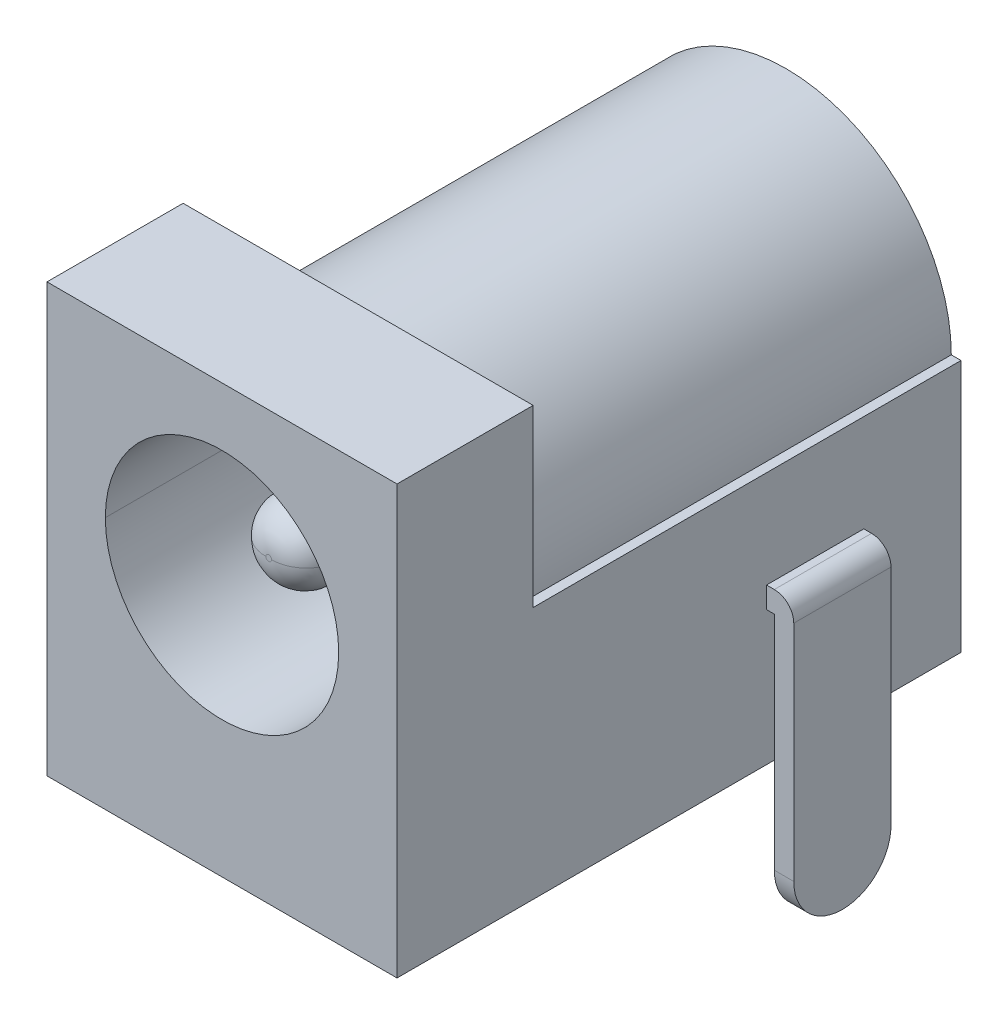
ISO-10303-21;
HEADER;
FILE_DESCRIPTION(('STEP AP214'),'2;1');
FILE_NAME('part.step','',(''),(''),'','','');
FILE_SCHEMA(('AUTOMOTIVE_DESIGN { 1 0 10303 214 1 1 1 1 }'));
ENDSEC;
DATA;
#1=APPLICATION_CONTEXT('core data for automotive mechanical design processes');
#2=APPLICATION_PROTOCOL_DEFINITION('international standard','automotive_design',2000,#1);
#3=PRODUCT_CONTEXT('',#1,'mechanical');
#4=PRODUCT('Part','Part','',(#3));
#5=PRODUCT_RELATED_PRODUCT_CATEGORY('part','',(#4));
#6=PRODUCT_DEFINITION_FORMATION('','',#4);
#7=PRODUCT_DEFINITION_CONTEXT('part definition',#1,'design');
#8=PRODUCT_DEFINITION('design','',#6,#7);
#9=PRODUCT_DEFINITION_SHAPE('','',#8);
#10=(LENGTH_UNIT() NAMED_UNIT(*) SI_UNIT(.MILLI.,.METRE.));
#11=(NAMED_UNIT(*) PLANE_ANGLE_UNIT() SI_UNIT($,.RADIAN.));
#12=(NAMED_UNIT(*) SI_UNIT($,.STERADIAN.) SOLID_ANGLE_UNIT());
#13=UNCERTAINTY_MEASURE_WITH_UNIT(LENGTH_MEASURE(1.E-05),#10,'distance_accuracy_value','');
#14=(GEOMETRIC_REPRESENTATION_CONTEXT(3) GLOBAL_UNCERTAINTY_ASSIGNED_CONTEXT((#13)) GLOBAL_UNIT_ASSIGNED_CONTEXT((#10,
#11,#12)) REPRESENTATION_CONTEXT('',''));
#15=CARTESIAN_POINT('',(0.,0.,0.));
#16=DIRECTION('',(0.,0.,1.));
#17=DIRECTION('',(1.,0.,0.));
#18=AXIS2_PLACEMENT_3D('',#15,#16,#17);
#19=CARTESIAN_POINT('',(4.5,6.5,-1.2));
#20=DIRECTION('',(0.,0.,1.));
#21=DIRECTION('',(1.,0.,0.));
#22=AXIS2_PLACEMENT_3D('',#19,#20,#21);
#23=PLANE('',#22);
#24=CARTESIAN_POINT('',(4.425,6.5,-1.2));
#25=CARTESIAN_POINT('',(4.425,6.65,-1.2));
#26=CARTESIAN_POINT('',(4.575,6.65,-1.2));
#27=CARTESIAN_POINT('',(4.575,6.5,-1.2));
#28=(BOUNDED_CURVE() B_SPLINE_CURVE(3,(#24,#25,#26,#27),.UNSPECIFIED.,.F.,
.F.) B_SPLINE_CURVE_WITH_KNOTS((4,4),(0.,1.),
.UNSPECIFIED.) CURVE() GEOMETRIC_REPRESENTATION_ITEM() RATIONAL_B_SPLINE_CURVE((1.,
0.333333333333,0.333333333333,1.)) REPRESENTATION_ITEM(''));
#29=CARTESIAN_POINT('',(4.425,6.5,-1.2));
#30=VERTEX_POINT('',#29);
#31=CARTESIAN_POINT('',(4.575,6.5,-1.2));
#32=VERTEX_POINT('',#31);
#33=EDGE_CURVE('E11',#30,#32,#28,.T.);
#34=ORIENTED_EDGE('',*,*,#33,.F.);
#35=CARTESIAN_POINT('',(4.575,6.5,-1.2));
#36=CARTESIAN_POINT('',(4.575,6.35,-1.2));
#37=CARTESIAN_POINT('',(4.425,6.35,-1.2));
#38=CARTESIAN_POINT('',(4.425,6.5,-1.2));
#39=(BOUNDED_CURVE() B_SPLINE_CURVE(3,(#35,#36,#37,#38),.UNSPECIFIED.,.F.,
.F.) B_SPLINE_CURVE_WITH_KNOTS((4,4),(0.,1.),
.UNSPECIFIED.) CURVE() GEOMETRIC_REPRESENTATION_ITEM() RATIONAL_B_SPLINE_CURVE((1.,
0.333333333333,0.333333333333,1.)) REPRESENTATION_ITEM(''));
#40=EDGE_CURVE('E541',#32,#30,#39,.T.);
#41=ORIENTED_EDGE('',*,*,#40,.F.);
#42=EDGE_LOOP('',(#34,#41));
#43=FACE_BOUND('',#42,.T.);
#44=ADVANCED_FACE('F17',(#43),#23,.T.);
#45=CARTESIAN_POINT('',(4.575,6.5,-1.2));
#46=CARTESIAN_POINT('',(4.575,6.65,-1.2));
#47=CARTESIAN_POINT('',(4.425,6.65,-1.2));
#48=CARTESIAN_POINT('',(4.425,6.5,-1.2));
#49=CARTESIAN_POINT('',(5.102207793864,6.5,-1.2));
#50=CARTESIAN_POINT('',(5.10220779386401,7.70441558772799,-1.2));
#51=CARTESIAN_POINT('',(3.897792206136,7.70441558772799,-1.2));
#52=CARTESIAN_POINT('',(3.897792206136,6.5,-1.2));
#53=CARTESIAN_POINT('',(5.475,6.5,-1.572792206136));
#54=CARTESIAN_POINT('',(5.475,8.45,-1.572792206136));
#55=CARTESIAN_POINT('',(3.525,8.45,-1.572792206136));
#56=CARTESIAN_POINT('',(3.525,6.5,-1.572792206136));
#57=CARTESIAN_POINT('',(5.475,6.5,-2.1));
#58=CARTESIAN_POINT('',(5.475,8.45,-2.1));
#59=CARTESIAN_POINT('',(3.525,8.45,-2.1));
#60=CARTESIAN_POINT('',(3.525,6.5,-2.1));
#61=(BOUNDED_SURFACE() B_SPLINE_SURFACE(3,3,((#45,#46,#47,#48),(#49,#50,#51,#52),(#53,#54,#55,
#56),(#57,#58,#59,#60)),.UNSPECIFIED.,.F.,.F.,.F.) B_SPLINE_SURFACE_WITH_KNOTS((4,4),(4,4),(0.,
1.),(0.,1.),.UNSPECIFIED.) GEOMETRIC_REPRESENTATION_ITEM() RATIONAL_B_SPLINE_SURFACE(((1.,
0.333333333333,0.333333333333,1.),(0.804737854124,0.268245951375,0.268245951375,0.804737854124),
(0.804737854124,0.268245951375,0.268245951375,0.804737854124),(1.,0.333333333333,0.333333333333,1.))) REPRESENTATION_ITEM('') SURFACE());
#62=CARTESIAN_POINT('',(4.425,6.5,-2.1));
#63=DIRECTION('',(0.,-1.,0.));
#64=DIRECTION('',(-1.,0.,0.));
#65=AXIS2_PLACEMENT_3D('',#62,#63,#64);
#66=CIRCLE('',#65,0.9);
#67=CARTESIAN_POINT('',(3.525,6.5,-2.1));
#68=VERTEX_POINT('',#67);
#69=EDGE_CURVE('E442',#30,#68,#66,.T.);
#70=CARTESIAN_POINT('',(4.575,6.5,-2.1));
#71=DIRECTION('',(0.,1.,0.));
#72=DIRECTION('',(1.,0.,0.));
#73=AXIS2_PLACEMENT_3D('',#70,#71,#72);
#74=CIRCLE('',#73,0.9);
#75=CARTESIAN_POINT('',(5.475,6.5,-2.1));
#76=VERTEX_POINT('',#75);
#77=EDGE_CURVE('E361',#32,#76,#74,.T.);
#78=CARTESIAN_POINT('',(4.5,6.5,-2.1));
#79=DIRECTION('',(0.,0.,-1.));
#80=DIRECTION('',(-1.,0.,0.));
#81=AXIS2_PLACEMENT_3D('',#78,#79,#80);
#82=CIRCLE('',#81,0.975);
#83=EDGE_CURVE('E298',#68,#76,#82,.T.);
#84=ORIENTED_EDGE('',*,*,#69,.F.);
#85=ORIENTED_EDGE('',*,*,#33,.T.);
#86=ORIENTED_EDGE('',*,*,#77,.T.);
#87=ORIENTED_EDGE('',*,*,#83,.F.);
#88=EDGE_LOOP('',(#84,#85,#86,#87));
#89=FACE_BOUND('',#88,.T.);
#90=ADVANCED_FACE('F616',(#89),#61,.T.);
#91=CARTESIAN_POINT('',(4.5,6.5,-1.2));
#92=DIRECTION('',(0.,0.,-1.));
#93=DIRECTION('',(-1.,0.,0.));
#94=AXIS2_PLACEMENT_3D('',#91,#92,#93);
#95=CYLINDRICAL_SURFACE('',#94,0.975);
#96=DIRECTION('',(0.,0.,-1.));
#97=VECTOR('',#96,1.);
#98=CARTESIAN_POINT('',(5.475,6.5,-1.2));
#99=LINE('',#98,#97);
#100=CARTESIAN_POINT('',(5.475,6.5,-9.2));
#101=VERTEX_POINT('',#100);
#102=EDGE_CURVE('E302',#76,#101,#99,.T.);
#103=ORIENTED_EDGE('',*,*,#102,.F.);
#104=CARTESIAN_POINT('',(4.5,6.5,-2.1));
#105=DIRECTION('',(0.,0.,-1.));
#106=DIRECTION('',(-1.,0.,0.));
#107=AXIS2_PLACEMENT_3D('',#104,#105,#106);
#108=CIRCLE('',#107,0.975);
#109=EDGE_CURVE('E438',#76,#68,#108,.T.);
#110=ORIENTED_EDGE('',*,*,#109,.T.);
#111=DIRECTION('',(0.,0.,-1.));
#112=VECTOR('',#111,1.);
#113=CARTESIAN_POINT('',(3.525,6.5,-1.2));
#114=LINE('',#113,#112);
#115=CARTESIAN_POINT('',(3.525,6.5,-9.2));
#116=VERTEX_POINT('',#115);
#117=EDGE_CURVE('E443',#68,#116,#114,.T.);
#118=ORIENTED_EDGE('',*,*,#117,.T.);
#119=CARTESIAN_POINT('',(4.5,6.5,-9.2));
#120=DIRECTION('',(0.,0.,-1.));
#121=DIRECTION('',(-1.,0.,0.));
#122=AXIS2_PLACEMENT_3D('',#119,#120,#121);
#123=CIRCLE('',#122,0.975);
#124=EDGE_CURVE('E458',#101,#116,#123,.T.);
#125=ORIENTED_EDGE('',*,*,#124,.F.);
#126=EDGE_LOOP('',(#103,#110,#118,#125));
#127=FACE_BOUND('',#126,.T.);
#128=ADVANCED_FACE('F622',(#127),#95,.T.);
#129=CARTESIAN_POINT('',(9.7,-2.25,-10.75));
#130=DIRECTION('',(-1.,0.,0.));
#131=DIRECTION('',(0.,0.,1.));
#132=AXIS2_PLACEMENT_3D('',#129,#130,#131);
#133=CYLINDRICAL_SURFACE('',#132,1.25);
#134=CARTESIAN_POINT('',(9.7,-2.25,-10.75));
#135=DIRECTION('',(1.,0.,0.));
#136=DIRECTION('',(0.,0.,1.));
#137=AXIS2_PLACEMENT_3D('',#134,#135,#136);
#138=CIRCLE('',#137,1.25);
#139=CARTESIAN_POINT('',(9.7,-2.25,-9.5));
#140=VERTEX_POINT('',#139);
#141=CARTESIAN_POINT('',(9.7,-2.25,-12.));
#142=VERTEX_POINT('',#141);
#143=EDGE_CURVE('E403',#140,#142,#138,.T.);
#144=ORIENTED_EDGE('',*,*,#143,.F.);
#145=DIRECTION('',(-1.,0.,0.));
#146=VECTOR('',#145,1.);
#147=CARTESIAN_POINT('',(11.759304320515,-2.25,-9.5));
#148=LINE('',#147,#146);
#149=CARTESIAN_POINT('',(9.2,-2.25,-9.5));
#150=VERTEX_POINT('',#149);
#151=EDGE_CURVE('E485',#140,#150,#148,.T.);
#152=ORIENTED_EDGE('',*,*,#151,.T.);
#153=CARTESIAN_POINT('',(9.2,-2.25,-10.75));
#154=DIRECTION('',(1.,0.,0.));
#155=DIRECTION('',(0.,0.,1.));
#156=AXIS2_PLACEMENT_3D('',#153,#154,#155);
#157=CIRCLE('',#156,1.25);
#158=CARTESIAN_POINT('',(9.2,-2.25,-12.));
#159=VERTEX_POINT('',#158);
#160=EDGE_CURVE('E416',#150,#159,#157,.T.);
#161=ORIENTED_EDGE('',*,*,#160,.T.);
#162=DIRECTION('',(1.,0.,0.));
#163=VECTOR('',#162,1.);
#164=CARTESIAN_POINT('',(11.759304320515,-2.25,-12.));
#165=LINE('',#164,#163);
#166=EDGE_CURVE('E29',#159,#142,#165,.T.);
#167=ORIENTED_EDGE('',*,*,#166,.T.);
#168=EDGE_LOOP('',(#144,#152,#161,#167));
#169=FACE_BOUND('',#168,.T.);
#170=ADVANCED_FACE('F645',(#169),#133,.T.);
#171=CARTESIAN_POINT('',(11.759304320515,4.,-12.));
#172=DIRECTION('',(0.,0.,1.));
#173=DIRECTION('',(1.,0.,0.));
#174=AXIS2_PLACEMENT_3D('',#171,#172,#173);
#175=PLANE('',#174);
#176=CARTESIAN_POINT('',(9.2,3.5,-12.));
#177=DIRECTION('',(0.,0.,1.));
#178=DIRECTION('',(-1.,0.,0.));
#179=AXIS2_PLACEMENT_3D('',#176,#177,#178);
#180=CIRCLE('',#179,0.5);
#181=CARTESIAN_POINT('',(9.7,3.5,-12.));
#182=VERTEX_POINT('',#181);
#183=CARTESIAN_POINT('',(9.2,4.,-12.));
#184=VERTEX_POINT('',#183);
#185=EDGE_CURVE('E333',#182,#184,#180,.T.);
#186=ORIENTED_EDGE('',*,*,#185,.F.);
#187=DIRECTION('',(0.,1.,0.));
#188=VECTOR('',#187,1.);
#189=CARTESIAN_POINT('',(9.7,-2.25,-12.));
#190=LINE('',#189,#188);
#191=EDGE_CURVE('E407',#142,#182,#190,.T.);
#192=ORIENTED_EDGE('',*,*,#191,.F.);
#193=ORIENTED_EDGE('',*,*,#166,.F.);
#194=DIRECTION('',(0.,1.,0.));
#195=VECTOR('',#194,1.);
#196=CARTESIAN_POINT('',(9.2,-2.25,-12.));
#197=LINE('',#196,#195);
#198=CARTESIAN_POINT('',(9.2,3.452242202242,-12.));
#199=VERTEX_POINT('',#198);
#200=EDGE_CURVE('E335',#159,#199,#197,.T.);
#201=ORIENTED_EDGE('',*,*,#200,.T.);
#202=DIRECTION('',(1.,0.,0.));
#203=VECTOR('',#202,1.);
#204=CARTESIAN_POINT('',(11.759304320515,3.452242202242,-12.));
#205=LINE('',#204,#203);
#206=CARTESIAN_POINT('',(9.,3.452242202242,-12.));
#207=VERTEX_POINT('',#206);
#208=EDGE_CURVE('E453',#207,#199,#205,.T.);
#209=ORIENTED_EDGE('',*,*,#208,.F.);
#210=DIRECTION('',(0.,-1.,0.));
#211=VECTOR('',#210,1.);
#212=CARTESIAN_POINT('',(9.,4.,-12.));
#213=LINE('',#212,#211);
#214=CARTESIAN_POINT('',(9.,4.,-12.));
#215=VERTEX_POINT('',#214);
#216=EDGE_CURVE('E366',#215,#207,#213,.T.);
#217=ORIENTED_EDGE('',*,*,#216,.F.);
#218=DIRECTION('',(-1.,0.,0.));
#219=VECTOR('',#218,1.);
#220=CARTESIAN_POINT('',(11.759304320515,4.,-12.));
#221=LINE('',#220,#219);
#222=EDGE_CURVE('E399',#184,#215,#221,.T.);
#223=ORIENTED_EDGE('',*,*,#222,.F.);
#224=EDGE_LOOP('',(#186,#192,#193,#201,#209,#217,#223));
#225=FACE_BOUND('',#224,.T.);
#226=ADVANCED_FACE('F641',(#225),#175,.F.);
#227=CARTESIAN_POINT('',(11.759304320515,4.,-9.5));
#228=DIRECTION('',(0.,0.,-1.));
#229=DIRECTION('',(0.,-1.,0.));
#230=AXIS2_PLACEMENT_3D('',#227,#228,#229);
#231=PLANE('',#230);
#232=CARTESIAN_POINT('',(9.2,3.5,-9.5));
#233=DIRECTION('',(0.,0.,-1.));
#234=DIRECTION('',(-1.,0.,0.));
#235=AXIS2_PLACEMENT_3D('',#232,#233,#234);
#236=CIRCLE('',#235,0.5);
#237=CARTESIAN_POINT('',(9.2,4.,-9.5));
#238=VERTEX_POINT('',#237);
#239=CARTESIAN_POINT('',(9.7,3.5,-9.5));
#240=VERTEX_POINT('',#239);
#241=EDGE_CURVE('E457',#238,#240,#236,.T.);
#242=ORIENTED_EDGE('',*,*,#241,.F.);
#243=DIRECTION('',(1.,0.,0.));
#244=VECTOR('',#243,1.);
#245=CARTESIAN_POINT('',(11.759304320515,4.,-9.5));
#246=LINE('',#245,#244);
#247=CARTESIAN_POINT('',(9.,4.,-9.5));
#248=VERTEX_POINT('',#247);
#249=EDGE_CURVE('E394',#248,#238,#246,.T.);
#250=ORIENTED_EDGE('',*,*,#249,.F.);
#251=DIRECTION('',(0.,1.,0.));
#252=VECTOR('',#251,1.);
#253=CARTESIAN_POINT('',(9.,4.,-9.5));
#254=LINE('',#253,#252);
#255=CARTESIAN_POINT('',(9.,3.452242202242,-9.5));
#256=VERTEX_POINT('',#255);
#257=EDGE_CURVE('E372',#256,#248,#254,.T.);
#258=ORIENTED_EDGE('',*,*,#257,.F.);
#259=DIRECTION('',(-1.,0.,0.));
#260=VECTOR('',#259,1.);
#261=CARTESIAN_POINT('',(11.759304320515,3.452242202242,-9.5));
#262=LINE('',#261,#260);
#263=CARTESIAN_POINT('',(9.2,3.452242202242,-9.5));
#264=VERTEX_POINT('',#263);
#265=EDGE_CURVE('E398',#264,#256,#262,.T.);
#266=ORIENTED_EDGE('',*,*,#265,.F.);
#267=DIRECTION('',(0.,-1.,0.));
#268=VECTOR('',#267,1.);
#269=CARTESIAN_POINT('',(9.2,-2.25,-9.5));
#270=LINE('',#269,#268);
#271=EDGE_CURVE('E461',#264,#150,#270,.T.);
#272=ORIENTED_EDGE('',*,*,#271,.T.);
#273=ORIENTED_EDGE('',*,*,#151,.F.);
#274=DIRECTION('',(0.,-1.,0.));
#275=VECTOR('',#274,1.);
#276=CARTESIAN_POINT('',(9.7,-2.25,-9.5));
#277=LINE('',#276,#275);
#278=EDGE_CURVE('E408',#240,#140,#277,.T.);
#279=ORIENTED_EDGE('',*,*,#278,.F.);
#280=EDGE_LOOP('',(#242,#250,#258,#266,#272,#273,#279));
#281=FACE_BOUND('',#280,.T.);
#282=ADVANCED_FACE('F644',(#281),#231,.F.);
#283=CARTESIAN_POINT('',(9.7,-2.25,-10.75));
#284=DIRECTION('',(1.,0.,0.));
#285=DIRECTION('',(0.,1.,0.));
#286=AXIS2_PLACEMENT_3D('',#283,#284,#285);
#287=PLANE('',#286);
#288=ORIENTED_EDGE('',*,*,#278,.T.);
#289=ORIENTED_EDGE('',*,*,#143,.T.);
#290=ORIENTED_EDGE('',*,*,#191,.T.);
#291=DIRECTION('',(0.,0.,-1.));
#292=VECTOR('',#291,1.);
#293=CARTESIAN_POINT('',(9.7,3.5,-10.75));
#294=LINE('',#293,#292);
#295=EDGE_CURVE('E336',#240,#182,#294,.T.);
#296=ORIENTED_EDGE('',*,*,#295,.F.);
#297=EDGE_LOOP('',(#288,#289,#290,#296));
#298=FACE_BOUND('',#297,.T.);
#299=ADVANCED_FACE('F656',(#298),#287,.T.);
#300=CARTESIAN_POINT('',(4.5,6.5,-9.2));
#301=DIRECTION('',(0.,0.,1.));
#302=DIRECTION('',(1.,0.,0.));
#303=AXIS2_PLACEMENT_3D('',#300,#301,#302);
#304=PLANE('',#303);
#305=CARTESIAN_POINT('',(4.5,6.5,-9.2));
#306=DIRECTION('',(0.,0.,1.));
#307=DIRECTION('',(1.,0.,0.));
#308=AXIS2_PLACEMENT_3D('',#305,#306,#307);
#309=CIRCLE('',#308,3.);
#310=CARTESIAN_POINT('',(7.5,6.5,-9.2));
#311=VERTEX_POINT('',#310);
#312=CARTESIAN_POINT('',(1.5,6.5,-9.2));
#313=VERTEX_POINT('',#312);
#314=EDGE_CURVE('E386',#311,#313,#309,.T.);
#315=ORIENTED_EDGE('',*,*,#314,.T.);
#316=CARTESIAN_POINT('',(4.5,6.5,-9.2));
#317=DIRECTION('',(0.,0.,1.));
#318=DIRECTION('',(1.,0.,0.));
#319=AXIS2_PLACEMENT_3D('',#316,#317,#318);
#320=CIRCLE('',#319,3.);
#321=EDGE_CURVE('E357',#313,#311,#320,.T.);
#322=ORIENTED_EDGE('',*,*,#321,.T.);
#323=EDGE_LOOP('',(#315,#322));
#324=FACE_BOUND('',#323,.T.);
#325=CARTESIAN_POINT('',(4.5,6.5,-9.2));
#326=DIRECTION('',(0.,0.,-1.));
#327=DIRECTION('',(-1.,0.,0.));
#328=AXIS2_PLACEMENT_3D('',#325,#326,#327);
#329=CIRCLE('',#328,0.975);
#330=EDGE_CURVE('E447',#116,#101,#329,.T.);
#331=ORIENTED_EDGE('',*,*,#330,.T.);
#332=ORIENTED_EDGE('',*,*,#124,.T.);
#333=EDGE_LOOP('',(#331,#332));
#334=FACE_BOUND('',#333,.T.);
#335=ADVANCED_FACE('F652',(#324,#334),#304,.T.);
#336=CARTESIAN_POINT('',(9.2,-2.25,-10.75));
#337=DIRECTION('',(1.,0.,0.));
#338=DIRECTION('',(0.,1.,0.));
#339=AXIS2_PLACEMENT_3D('',#336,#337,#338);
#340=PLANE('',#339);
#341=DIRECTION('',(0.,0.,-1.));
#342=VECTOR('',#341,1.);
#343=CARTESIAN_POINT('',(9.2,3.452242202242,-9.5));
#344=LINE('',#343,#342);
#345=EDGE_CURVE('E434',#264,#199,#344,.T.);
#346=ORIENTED_EDGE('',*,*,#345,.T.);
#347=ORIENTED_EDGE('',*,*,#200,.F.);
#348=ORIENTED_EDGE('',*,*,#160,.F.);
#349=ORIENTED_EDGE('',*,*,#271,.F.);
#350=EDGE_LOOP('',(#346,#347,#348,#349));
#351=FACE_BOUND('',#350,.T.);
#352=ADVANCED_FACE('F655',(#351),#340,.F.);
#353=CARTESIAN_POINT('',(9.2,3.5,-10.75));
#354=DIRECTION('',(0.,0.,-1.));
#355=DIRECTION('',(-1.,0.,0.));
#356=AXIS2_PLACEMENT_3D('',#353,#354,#355);
#357=CYLINDRICAL_SURFACE('',#356,0.5);
#358=ORIENTED_EDGE('',*,*,#241,.T.);
#359=ORIENTED_EDGE('',*,*,#295,.T.);
#360=ORIENTED_EDGE('',*,*,#185,.T.);
#361=DIRECTION('',(0.,0.,1.));
#362=VECTOR('',#361,1.);
#363=CARTESIAN_POINT('',(9.2,4.,-9.5));
#364=LINE('',#363,#362);
#365=EDGE_CURVE('E381',#184,#238,#364,.T.);
#366=ORIENTED_EDGE('',*,*,#365,.T.);
#367=EDGE_LOOP('',(#358,#359,#360,#366));
#368=FACE_BOUND('',#367,.T.);
#369=ADVANCED_FACE('F19',(#368),#357,.T.);
#370=CARTESIAN_POINT('',(5.75,-3.5,-7.45));
#371=DIRECTION('',(-1.,0.,0.));
#372=DIRECTION('',(0.,0.,1.));
#373=AXIS2_PLACEMENT_3D('',#370,#371,#372);
#374=PLANE('',#373);
#375=DIRECTION('',(0.,0.,1.));
#376=VECTOR('',#375,1.);
#377=CARTESIAN_POINT('',(5.75,-2.779156197589,-4.073241199019));
#378=LINE('',#377,#376);
#379=CARTESIAN_POINT('',(5.75,-2.779156197589,-7.95));
#380=VERTEX_POINT('',#379);
#381=CARTESIAN_POINT('',(5.75,-2.779156197589,-7.45));
#382=VERTEX_POINT('',#381);
#383=EDGE_CURVE('E454',#380,#382,#378,.T.);
#384=ORIENTED_EDGE('',*,*,#383,.F.);
#385=DIRECTION('',(0.,1.,0.));
#386=VECTOR('',#385,1.);
#387=CARTESIAN_POINT('',(5.75,-3.5,-7.95));
#388=LINE('',#387,#386);
#389=CARTESIAN_POINT('',(5.75,0.,-7.95));
#390=VERTEX_POINT('',#389);
#391=EDGE_CURVE('E378',#380,#390,#388,.T.);
#392=ORIENTED_EDGE('',*,*,#391,.T.);
#393=DIRECTION('',(0.,0.,-1.));
#394=VECTOR('',#393,1.);
#395=CARTESIAN_POINT('',(5.75,0.,-7.45));
#396=LINE('',#395,#394);
#397=CARTESIAN_POINT('',(5.75,0.,-7.45));
#398=VERTEX_POINT('',#397);
#399=EDGE_CURVE('E356',#398,#390,#396,.T.);
#400=ORIENTED_EDGE('',*,*,#399,.F.);
#401=DIRECTION('',(0.,-1.,0.));
#402=VECTOR('',#401,1.);
#403=CARTESIAN_POINT('',(5.75,-3.5,-7.45));
#404=LINE('',#403,#402);
#405=EDGE_CURVE('E306',#398,#382,#404,.T.);
#406=ORIENTED_EDGE('',*,*,#405,.T.);
#407=EDGE_LOOP('',(#384,#392,#400,#406));
#408=FACE_BOUND('',#407,.T.);
#409=ADVANCED_FACE('F591',(#408),#374,.F.);
#410=CARTESIAN_POINT('',(4.5,-1.95,-4.073241199019));
#411=DIRECTION('',(0.,0.,-1.));
#412=DIRECTION('',(-1.,0.,0.));
#413=AXIS2_PLACEMENT_3D('',#410,#411,#412);
#414=CYLINDRICAL_SURFACE('',#413,1.5);
#415=CARTESIAN_POINT('',(4.5,-1.95,-7.45));
#416=DIRECTION('',(0.,0.,-1.));
#417=DIRECTION('',(-1.,0.,0.));
#418=AXIS2_PLACEMENT_3D('',#415,#416,#417);
#419=CIRCLE('',#418,1.5);
#420=CARTESIAN_POINT('',(3.25,-2.779156197589,-7.45));
#421=VERTEX_POINT('',#420);
#422=EDGE_CURVE('E267',#382,#421,#419,.T.);
#423=ORIENTED_EDGE('',*,*,#422,.T.);
#424=DIRECTION('',(0.,0.,-1.));
#425=VECTOR('',#424,1.);
#426=CARTESIAN_POINT('',(3.25,-2.779156197589,-7.45));
#427=LINE('',#426,#425);
#428=CARTESIAN_POINT('',(3.25,-2.779156197589,-7.95));
#429=VERTEX_POINT('',#428);
#430=EDGE_CURVE('E437',#421,#429,#427,.T.);
#431=ORIENTED_EDGE('',*,*,#430,.T.);
#432=CARTESIAN_POINT('',(4.5,-1.95,-7.95));
#433=DIRECTION('',(0.,0.,1.));
#434=DIRECTION('',(-1.,0.,0.));
#435=AXIS2_PLACEMENT_3D('',#432,#433,#434);
#436=CIRCLE('',#435,1.5);
#437=EDGE_CURVE('E305',#429,#380,#436,.T.);
#438=ORIENTED_EDGE('',*,*,#437,.T.);
#439=ORIENTED_EDGE('',*,*,#383,.T.);
#440=EDGE_LOOP('',(#423,#431,#438,#439));
#441=FACE_BOUND('',#440,.T.);
#442=ADVANCED_FACE('F598',(#441),#414,.T.);
#443=CARTESIAN_POINT('',(3.25,-3.5,-7.45));
#444=DIRECTION('',(1.,0.,0.));
#445=DIRECTION('',(0.,1.,0.));
#446=AXIS2_PLACEMENT_3D('',#443,#444,#445);
#447=PLANE('',#446);
#448=ORIENTED_EDGE('',*,*,#430,.F.);
#449=DIRECTION('',(0.,1.,0.));
#450=VECTOR('',#449,1.);
#451=CARTESIAN_POINT('',(3.25,-3.5,-7.45));
#452=LINE('',#451,#450);
#453=CARTESIAN_POINT('',(3.25,0.,-7.45));
#454=VERTEX_POINT('',#453);
#455=EDGE_CURVE('E303',#421,#454,#452,.T.);
#456=ORIENTED_EDGE('',*,*,#455,.T.);
#457=DIRECTION('',(0.,0.,1.));
#458=VECTOR('',#457,1.);
#459=CARTESIAN_POINT('',(3.25,0.,-7.45));
#460=LINE('',#459,#458);
#461=CARTESIAN_POINT('',(3.25,0.,-7.95));
#462=VERTEX_POINT('',#461);
#463=EDGE_CURVE('E342',#462,#454,#460,.T.);
#464=ORIENTED_EDGE('',*,*,#463,.F.);
#465=DIRECTION('',(0.,-1.,0.));
#466=VECTOR('',#465,1.);
#467=CARTESIAN_POINT('',(3.25,-3.5,-7.95));
#468=LINE('',#467,#466);
#469=EDGE_CURVE('E314',#462,#429,#468,.T.);
#470=ORIENTED_EDGE('',*,*,#469,.T.);
#471=EDGE_LOOP('',(#448,#456,#464,#470));
#472=FACE_BOUND('',#471,.T.);
#473=ADVANCED_FACE('F602',(#472),#447,.F.);
#474=CARTESIAN_POINT('',(6.,-3.5,-13.95));
#475=DIRECTION('',(-1.,0.,0.));
#476=DIRECTION('',(0.,0.,1.));
#477=AXIS2_PLACEMENT_3D('',#474,#475,#476);
#478=PLANE('',#477);
#479=DIRECTION('',(0.,1.,0.));
#480=VECTOR('',#479,1.);
#481=CARTESIAN_POINT('',(6.,-3.5,-13.95));
#482=LINE('',#481,#480);
#483=CARTESIAN_POINT('',(6.,-1.95,-13.95));
#484=VERTEX_POINT('',#483);
#485=CARTESIAN_POINT('',(6.,0.,-13.95));
#486=VERTEX_POINT('',#485);
#487=EDGE_CURVE('E255',#484,#486,#482,.T.);
#488=ORIENTED_EDGE('',*,*,#487,.T.);
#489=DIRECTION('',(0.,0.,-1.));
#490=VECTOR('',#489,1.);
#491=CARTESIAN_POINT('',(6.,0.,-13.95));
#492=LINE('',#491,#490);
#493=CARTESIAN_POINT('',(6.,0.,-13.45));
#494=VERTEX_POINT('',#493);
#495=EDGE_CURVE('E260',#494,#486,#492,.T.);
#496=ORIENTED_EDGE('',*,*,#495,.F.);
#497=DIRECTION('',(0.,-1.,0.));
#498=VECTOR('',#497,1.);
#499=CARTESIAN_POINT('',(6.,-3.5,-13.45));
#500=LINE('',#499,#498);
#501=CARTESIAN_POINT('',(6.,-1.95,-13.45));
#502=VERTEX_POINT('',#501);
#503=EDGE_CURVE('E377',#494,#502,#500,.T.);
#504=ORIENTED_EDGE('',*,*,#503,.T.);
#505=DIRECTION('',(0.,0.,1.));
#506=VECTOR('',#505,1.);
#507=CARTESIAN_POINT('',(6.,-1.95,-4.073241199019));
#508=LINE('',#507,#506);
#509=EDGE_CURVE('E262',#484,#502,#508,.T.);
#510=ORIENTED_EDGE('',*,*,#509,.F.);
#511=EDGE_LOOP('',(#488,#496,#504,#510));
#512=FACE_BOUND('',#511,.T.);
#513=ADVANCED_FACE('F257',(#512),#478,.F.);
#514=CARTESIAN_POINT('',(4.5,-1.95,-4.073241199019));
#515=DIRECTION('',(0.,0.,-1.));
#516=DIRECTION('',(-1.,0.,0.));
#517=AXIS2_PLACEMENT_3D('',#514,#515,#516);
#518=CYLINDRICAL_SURFACE('',#517,1.5);
#519=ORIENTED_EDGE('',*,*,#509,.T.);
#520=CARTESIAN_POINT('',(4.5,-1.95,-13.45));
#521=DIRECTION('',(0.,0.,-1.));
#522=DIRECTION('',(-1.,0.,0.));
#523=AXIS2_PLACEMENT_3D('',#520,#521,#522);
#524=CIRCLE('',#523,1.5);
#525=CARTESIAN_POINT('',(3.,-1.95,-13.45));
#526=VERTEX_POINT('',#525);
#527=EDGE_CURVE('E505',#502,#526,#524,.T.);
#528=ORIENTED_EDGE('',*,*,#527,.T.);
#529=DIRECTION('',(0.,0.,-1.));
#530=VECTOR('',#529,1.);
#531=CARTESIAN_POINT('',(3.,-1.95,-13.95));
#532=LINE('',#531,#530);
#533=CARTESIAN_POINT('',(3.,-1.95,-13.95));
#534=VERTEX_POINT('',#533);
#535=EDGE_CURVE('E382',#526,#534,#532,.T.);
#536=ORIENTED_EDGE('',*,*,#535,.T.);
#537=CARTESIAN_POINT('',(4.5,-1.95,-13.95));
#538=DIRECTION('',(0.,0.,1.));
#539=DIRECTION('',(-1.,0.,0.));
#540=AXIS2_PLACEMENT_3D('',#537,#538,#539);
#541=CIRCLE('',#540,1.5);
#542=EDGE_CURVE('E376',#534,#484,#541,.T.);
#543=ORIENTED_EDGE('',*,*,#542,.T.);
#544=EDGE_LOOP('',(#519,#528,#536,#543));
#545=FACE_BOUND('',#544,.T.);
#546=ADVANCED_FACE('F610',(#545),#518,.T.);
#547=CARTESIAN_POINT('',(3.,-3.5,-13.95));
#548=DIRECTION('',(1.,0.,0.));
#549=DIRECTION('',(0.,0.,1.));
#550=AXIS2_PLACEMENT_3D('',#547,#548,#549);
#551=PLANE('',#550);
#552=ORIENTED_EDGE('',*,*,#535,.F.);
#553=DIRECTION('',(0.,1.,0.));
#554=VECTOR('',#553,1.);
#555=CARTESIAN_POINT('',(3.,-3.5,-13.45));
#556=LINE('',#555,#554);
#557=CARTESIAN_POINT('',(3.,0.,-13.45));
#558=VERTEX_POINT('',#557);
#559=EDGE_CURVE('E373',#526,#558,#556,.T.);
#560=ORIENTED_EDGE('',*,*,#559,.T.);
#561=DIRECTION('',(0.,0.,1.));
#562=VECTOR('',#561,1.);
#563=CARTESIAN_POINT('',(3.,0.,-13.95));
#564=LINE('',#563,#562);
#565=CARTESIAN_POINT('',(3.,0.,-13.95));
#566=VERTEX_POINT('',#565);
#567=EDGE_CURVE('E278',#566,#558,#564,.T.);
#568=ORIENTED_EDGE('',*,*,#567,.F.);
#569=DIRECTION('',(0.,-1.,0.));
#570=VECTOR('',#569,1.);
#571=CARTESIAN_POINT('',(3.,-3.5,-13.95));
#572=LINE('',#571,#570);
#573=EDGE_CURVE('E268',#566,#534,#572,.T.);
#574=ORIENTED_EDGE('',*,*,#573,.T.);
#575=EDGE_LOOP('',(#552,#560,#568,#574));
#576=FACE_BOUND('',#575,.T.);
#577=ADVANCED_FACE('F759',(#576),#551,.F.);
#578=CARTESIAN_POINT('',(4.5,6.5,-9.2));
#579=DIRECTION('',(0.,0.,1.));
#580=DIRECTION('',(1.,0.,0.));
#581=AXIS2_PLACEMENT_3D('',#578,#579,#580);
#582=CYLINDRICAL_SURFACE('',#581,3.);
#583=DIRECTION('',(0.,0.,1.));
#584=VECTOR('',#583,1.);
#585=CARTESIAN_POINT('',(1.5,6.5,-9.2));
#586=LINE('',#585,#584);
#587=CARTESIAN_POINT('',(1.5,6.5,0.));
#588=VERTEX_POINT('',#587);
#589=EDGE_CURVE('E360',#313,#588,#586,.T.);
#590=ORIENTED_EDGE('',*,*,#589,.F.);
#591=ORIENTED_EDGE('',*,*,#314,.F.);
#592=DIRECTION('',(0.,0.,1.));
#593=VECTOR('',#592,1.);
#594=CARTESIAN_POINT('',(7.5,6.5,-9.2));
#595=LINE('',#594,#593);
#596=CARTESIAN_POINT('',(7.5,6.5,0.));
#597=VERTEX_POINT('',#596);
#598=EDGE_CURVE('E295',#311,#597,#595,.T.);
#599=ORIENTED_EDGE('',*,*,#598,.T.);
#600=CARTESIAN_POINT('',(4.5,6.5,0.));
#601=DIRECTION('',(0.,0.,1.));
#602=DIRECTION('',(1.,0.,0.));
#603=AXIS2_PLACEMENT_3D('',#600,#601,#602);
#604=CIRCLE('',#603,3.);
#605=EDGE_CURVE('E331',#597,#588,#604,.T.);
#606=ORIENTED_EDGE('',*,*,#605,.T.);
#607=EDGE_LOOP('',(#590,#591,#599,#606));
#608=FACE_BOUND('',#607,.T.);
#609=ADVANCED_FACE('F627',(#608),#582,.F.);
#610=CARTESIAN_POINT('',(11.759304320515,3.452242202242,-9.5));
#611=DIRECTION('',(0.,1.,0.));
#612=DIRECTION('',(1.,0.,0.));
#613=AXIS2_PLACEMENT_3D('',#610,#611,#612);
#614=PLANE('',#613);
#615=ORIENTED_EDGE('',*,*,#265,.T.);
#616=DIRECTION('',(0.,0.,1.));
#617=VECTOR('',#616,1.);
#618=CARTESIAN_POINT('',(9.,3.452242202242,-14.5));
#619=LINE('',#618,#617);
#620=EDGE_CURVE('E393',#207,#256,#619,.T.);
#621=ORIENTED_EDGE('',*,*,#620,.F.);
#622=ORIENTED_EDGE('',*,*,#208,.T.);
#623=ORIENTED_EDGE('',*,*,#345,.F.);
#624=EDGE_LOOP('',(#615,#621,#622,#623));
#625=FACE_BOUND('',#624,.T.);
#626=ADVANCED_FACE('F751',(#625),#614,.F.);
#627=CARTESIAN_POINT('',(11.759304320515,4.,-9.5));
#628=DIRECTION('',(0.,-1.,0.));
#629=DIRECTION('',(0.,0.,-1.));
#630=AXIS2_PLACEMENT_3D('',#627,#628,#629);
#631=PLANE('',#630);
#632=ORIENTED_EDGE('',*,*,#365,.F.);
#633=ORIENTED_EDGE('',*,*,#222,.T.);
#634=DIRECTION('',(0.,0.,-1.));
#635=VECTOR('',#634,1.);
#636=CARTESIAN_POINT('',(9.,4.,-14.5));
#637=LINE('',#636,#635);
#638=EDGE_CURVE('E345',#248,#215,#637,.T.);
#639=ORIENTED_EDGE('',*,*,#638,.F.);
#640=ORIENTED_EDGE('',*,*,#249,.T.);
#641=EDGE_LOOP('',(#632,#633,#639,#640));
#642=FACE_BOUND('',#641,.T.);
#643=ADVANCED_FACE('F754',(#642),#631,.F.);
#644=CARTESIAN_POINT('',(3.25,-3.5,-7.95));
#645=DIRECTION('',(0.,0.,1.));
#646=DIRECTION('',(1.,0.,0.));
#647=AXIS2_PLACEMENT_3D('',#644,#645,#646);
#648=PLANE('',#647);
#649=ORIENTED_EDGE('',*,*,#437,.F.);
#650=ORIENTED_EDGE('',*,*,#469,.F.);
#651=DIRECTION('',(-1.,0.,0.));
#652=VECTOR('',#651,1.);
#653=CARTESIAN_POINT('',(0.,0.,-7.95));
#654=LINE('',#653,#652);
#655=EDGE_CURVE('E346',#390,#462,#654,.T.);
#656=ORIENTED_EDGE('',*,*,#655,.F.);
#657=ORIENTED_EDGE('',*,*,#391,.F.);
#658=EDGE_LOOP('',(#649,#650,#656,#657));
#659=FACE_BOUND('',#658,.T.);
#660=ADVANCED_FACE('F601',(#659),#648,.F.);
#661=CARTESIAN_POINT('',(3.25,-3.5,-7.45));
#662=DIRECTION('',(0.,0.,-1.));
#663=DIRECTION('',(0.,-1.,0.));
#664=AXIS2_PLACEMENT_3D('',#661,#662,#663);
#665=PLANE('',#664);
#666=ORIENTED_EDGE('',*,*,#422,.F.);
#667=ORIENTED_EDGE('',*,*,#405,.F.);
#668=DIRECTION('',(1.,0.,0.));
#669=VECTOR('',#668,1.);
#670=CARTESIAN_POINT('',(0.,0.,-7.45));
#671=LINE('',#670,#669);
#672=EDGE_CURVE('E506',#454,#398,#671,.T.);
#673=ORIENTED_EDGE('',*,*,#672,.F.);
#674=ORIENTED_EDGE('',*,*,#455,.F.);
#675=EDGE_LOOP('',(#666,#667,#673,#674));
#676=FACE_BOUND('',#675,.T.);
#677=ADVANCED_FACE('F596',(#676),#665,.F.);
#678=CARTESIAN_POINT('',(3.,-3.5,-13.95));
#679=DIRECTION('',(0.,0.,1.));
#680=DIRECTION('',(1.,0.,0.));
#681=AXIS2_PLACEMENT_3D('',#678,#679,#680);
#682=PLANE('',#681);
#683=ORIENTED_EDGE('',*,*,#542,.F.);
#684=ORIENTED_EDGE('',*,*,#573,.F.);
#685=DIRECTION('',(-1.,0.,0.));
#686=VECTOR('',#685,1.);
#687=CARTESIAN_POINT('',(0.,0.,-13.95));
#688=LINE('',#687,#686);
#689=EDGE_CURVE('E271',#486,#566,#688,.T.);
#690=ORIENTED_EDGE('',*,*,#689,.F.);
#691=ORIENTED_EDGE('',*,*,#487,.F.);
#692=EDGE_LOOP('',(#683,#684,#690,#691));
#693=FACE_BOUND('',#692,.T.);
#694=ADVANCED_FACE('F272',(#693),#682,.F.);
#695=CARTESIAN_POINT('',(3.,-3.5,-13.45));
#696=DIRECTION('',(0.,0.,-1.));
#697=DIRECTION('',(0.,-1.,0.));
#698=AXIS2_PLACEMENT_3D('',#695,#696,#697);
#699=PLANE('',#698);
#700=ORIENTED_EDGE('',*,*,#527,.F.);
#701=ORIENTED_EDGE('',*,*,#503,.F.);
#702=DIRECTION('',(1.,0.,0.));
#703=VECTOR('',#702,1.);
#704=CARTESIAN_POINT('',(0.,0.,-13.45));
#705=LINE('',#704,#703);
#706=EDGE_CURVE('E282',#558,#494,#705,.T.);
#707=ORIENTED_EDGE('',*,*,#706,.F.);
#708=ORIENTED_EDGE('',*,*,#559,.F.);
#709=EDGE_LOOP('',(#700,#701,#707,#708));
#710=FACE_BOUND('',#709,.T.);
#711=ADVANCED_FACE('F670',(#710),#699,.F.);
#712=CARTESIAN_POINT('',(0.,11.,0.));
#713=DIRECTION('',(0.,0.,-1.));
#714=DIRECTION('',(0.,-1.,0.));
#715=AXIS2_PLACEMENT_3D('',#712,#713,#714);
#716=PLANE('',#715);
#717=ORIENTED_EDGE('',*,*,#605,.F.);
#718=CARTESIAN_POINT('',(4.5,6.5,0.));
#719=DIRECTION('',(0.,0.,1.));
#720=DIRECTION('',(1.,0.,0.));
#721=AXIS2_PLACEMENT_3D('',#718,#719,#720);
#722=CIRCLE('',#721,3.);
#723=EDGE_CURVE('E299',#588,#597,#722,.T.);
#724=ORIENTED_EDGE('',*,*,#723,.F.);
#725=EDGE_LOOP('',(#717,#724));
#726=FACE_BOUND('',#725,.T.);
#727=DIRECTION('',(-1.,0.,0.));
#728=VECTOR('',#727,1.);
#729=CARTESIAN_POINT('',(0.,0.,0.));
#730=LINE('',#729,#728);
#731=CARTESIAN_POINT('',(9.,0.,0.));
#732=VERTEX_POINT('',#731);
#733=CARTESIAN_POINT('',(0.,0.,0.));
#734=VERTEX_POINT('',#733);
#735=EDGE_CURVE('E293',#732,#734,#730,.T.);
#736=ORIENTED_EDGE('',*,*,#735,.F.);
#737=DIRECTION('',(0.,-1.,0.));
#738=VECTOR('',#737,1.);
#739=CARTESIAN_POINT('',(9.,0.,0.));
#740=LINE('',#739,#738);
#741=CARTESIAN_POINT('',(9.,11.,0.));
#742=VERTEX_POINT('',#741);
#743=EDGE_CURVE('E371',#742,#732,#740,.T.);
#744=ORIENTED_EDGE('',*,*,#743,.F.);
#745=DIRECTION('',(1.,0.,0.));
#746=VECTOR('',#745,1.);
#747=CARTESIAN_POINT('',(0.,11.,0.));
#748=LINE('',#747,#746);
#749=CARTESIAN_POINT('',(0.,11.,0.));
#750=VERTEX_POINT('',#749);
#751=EDGE_CURVE('E426',#750,#742,#748,.T.);
#752=ORIENTED_EDGE('',*,*,#751,.F.);
#753=DIRECTION('',(0.,1.,0.));
#754=VECTOR('',#753,1.);
#755=CARTESIAN_POINT('',(0.,0.,0.));
#756=LINE('',#755,#754);
#757=EDGE_CURVE('E289',#734,#750,#756,.T.);
#758=ORIENTED_EDGE('',*,*,#757,.F.);
#759=EDGE_LOOP('',(#736,#744,#752,#758));
#760=FACE_BOUND('',#759,.T.);
#761=ADVANCED_FACE('F666',(#726,#760),#716,.F.);
#762=CARTESIAN_POINT('',(0.,11.,-14.5));
#763=DIRECTION('',(0.,1.,0.));
#764=DIRECTION('',(1.,0.,0.));
#765=AXIS2_PLACEMENT_3D('',#762,#763,#764);
#766=PLANE('',#765);
#767=DIRECTION('',(0.,0.,-1.));
#768=VECTOR('',#767,1.);
#769=CARTESIAN_POINT('',(0.,11.,-14.5));
#770=LINE('',#769,#768);
#771=CARTESIAN_POINT('',(0.,11.,-3.5));
#772=VERTEX_POINT('',#771);
#773=EDGE_CURVE('E341',#750,#772,#770,.T.);
#774=ORIENTED_EDGE('',*,*,#773,.F.);
#775=ORIENTED_EDGE('',*,*,#751,.T.);
#776=DIRECTION('',(0.,0.,1.));
#777=VECTOR('',#776,1.);
#778=CARTESIAN_POINT('',(9.,11.,-14.5));
#779=LINE('',#778,#777);
#780=CARTESIAN_POINT('',(9.,11.,-3.5));
#781=VERTEX_POINT('',#780);
#782=EDGE_CURVE('E367',#781,#742,#779,.T.);
#783=ORIENTED_EDGE('',*,*,#782,.F.);
#784=DIRECTION('',(1.,0.,0.));
#785=VECTOR('',#784,1.);
#786=CARTESIAN_POINT('',(0.,11.,-3.5));
#787=LINE('',#786,#785);
#788=EDGE_CURVE('E409',#772,#781,#787,.T.);
#789=ORIENTED_EDGE('',*,*,#788,.F.);
#790=EDGE_LOOP('',(#774,#775,#783,#789));
#791=FACE_BOUND('',#790,.T.);
#792=ADVANCED_FACE('F650',(#791),#766,.T.);
#793=CARTESIAN_POINT('',(9.,0.,-14.5));
#794=DIRECTION('',(1.,0.,0.));
#795=DIRECTION('',(0.,1.,0.));
#796=AXIS2_PLACEMENT_3D('',#793,#794,#795);
#797=PLANE('',#796);
#798=DIRECTION('',(0.,0.,1.));
#799=VECTOR('',#798,1.);
#800=CARTESIAN_POINT('',(9.,0.,-14.5));
#801=LINE('',#800,#799);
#802=CARTESIAN_POINT('',(9.,0.,-14.5));
#803=VERTEX_POINT('',#802);
#804=EDGE_CURVE('E389',#803,#732,#801,.T.);
#805=ORIENTED_EDGE('',*,*,#804,.F.);
#806=DIRECTION('',(0.,-1.,0.));
#807=VECTOR('',#806,1.);
#808=CARTESIAN_POINT('',(9.,11.,-14.5));
#809=LINE('',#808,#807);
#810=CARTESIAN_POINT('',(9.,6.5,-14.5));
#811=VERTEX_POINT('',#810);
#812=EDGE_CURVE('E537',#811,#803,#809,.T.);
#813=ORIENTED_EDGE('',*,*,#812,.F.);
#814=DIRECTION('',(0.,0.,1.));
#815=VECTOR('',#814,1.);
#816=CARTESIAN_POINT('',(9.,6.5,10.062305898749));
#817=LINE('',#816,#815);
#818=CARTESIAN_POINT('',(9.,6.5,-3.5));
#819=VERTEX_POINT('',#818);
#820=EDGE_CURVE('E466',#811,#819,#817,.T.);
#821=ORIENTED_EDGE('',*,*,#820,.T.);
#822=DIRECTION('',(0.,-1.,0.));
#823=VECTOR('',#822,1.);
#824=CARTESIAN_POINT('',(9.,11.,-3.5));
#825=LINE('',#824,#823);
#826=EDGE_CURVE('E474',#781,#819,#825,.T.);
#827=ORIENTED_EDGE('',*,*,#826,.F.);
#828=ORIENTED_EDGE('',*,*,#782,.T.);
#829=ORIENTED_EDGE('',*,*,#743,.T.);
#830=EDGE_LOOP('',(#805,#813,#821,#827,#828,#829));
#831=FACE_BOUND('',#830,.T.);
#832=ORIENTED_EDGE('',*,*,#638,.T.);
#833=ORIENTED_EDGE('',*,*,#216,.T.);
#834=ORIENTED_EDGE('',*,*,#620,.T.);
#835=ORIENTED_EDGE('',*,*,#257,.T.);
#836=EDGE_LOOP('',(#832,#833,#834,#835));
#837=FACE_BOUND('',#836,.T.);
#838=ADVANCED_FACE('F647',(#831,#837),#797,.T.);
#839=CARTESIAN_POINT('',(0.,0.,-14.5));
#840=DIRECTION('',(0.,-1.,0.));
#841=DIRECTION('',(0.,0.,-1.));
#842=AXIS2_PLACEMENT_3D('',#839,#840,#841);
#843=PLANE('',#842);
#844=ORIENTED_EDGE('',*,*,#672,.T.);
#845=ORIENTED_EDGE('',*,*,#399,.T.);
#846=ORIENTED_EDGE('',*,*,#655,.T.);
#847=ORIENTED_EDGE('',*,*,#463,.T.);
#848=EDGE_LOOP('',(#844,#845,#846,#847));
#849=FACE_BOUND('',#848,.T.);
#850=DIRECTION('',(-1.,0.,0.));
#851=VECTOR('',#850,1.);
#852=CARTESIAN_POINT('',(0.,0.,-14.5));
#853=LINE('',#852,#851);
#854=CARTESIAN_POINT('',(0.,0.,-14.5));
#855=VERTEX_POINT('',#854);
#856=EDGE_CURVE('E527',#803,#855,#853,.T.);
#857=ORIENTED_EDGE('',*,*,#856,.F.);
#858=ORIENTED_EDGE('',*,*,#804,.T.);
#859=ORIENTED_EDGE('',*,*,#735,.T.);
#860=DIRECTION('',(0.,0.,1.));
#861=VECTOR('',#860,1.);
#862=CARTESIAN_POINT('',(0.,0.,-14.5));
#863=LINE('',#862,#861);
#864=EDGE_CURVE('E337',#855,#734,#863,.T.);
#865=ORIENTED_EDGE('',*,*,#864,.F.);
#866=EDGE_LOOP('',(#857,#858,#859,#865));
#867=FACE_BOUND('',#866,.T.);
#868=ORIENTED_EDGE('',*,*,#706,.T.);
#869=ORIENTED_EDGE('',*,*,#495,.T.);
#870=ORIENTED_EDGE('',*,*,#689,.T.);
#871=ORIENTED_EDGE('',*,*,#567,.T.);
#872=EDGE_LOOP('',(#868,#869,#870,#871));
#873=FACE_BOUND('',#872,.T.);
#874=ADVANCED_FACE('F280',(#849,#867,#873),#843,.T.);
#875=CARTESIAN_POINT('',(0.,0.,-14.5));
#876=DIRECTION('',(-1.,0.,0.));
#877=DIRECTION('',(0.,0.,1.));
#878=AXIS2_PLACEMENT_3D('',#875,#876,#877);
#879=PLANE('',#878);
#880=ORIENTED_EDGE('',*,*,#773,.T.);
#881=DIRECTION('',(0.,1.,0.));
#882=VECTOR('',#881,1.);
#883=CARTESIAN_POINT('',(0.,11.,-3.5));
#884=LINE('',#883,#882);
#885=CARTESIAN_POINT('',(0.,6.5,-3.5));
#886=VERTEX_POINT('',#885);
#887=EDGE_CURVE('E413',#886,#772,#884,.T.);
#888=ORIENTED_EDGE('',*,*,#887,.F.);
#889=DIRECTION('',(0.,0.,-1.));
#890=VECTOR('',#889,1.);
#891=CARTESIAN_POINT('',(0.,6.5,10.062305898749));
#892=LINE('',#891,#890);
#893=CARTESIAN_POINT('',(0.,6.5,-14.5));
#894=VERTEX_POINT('',#893);
#895=EDGE_CURVE('E352',#886,#894,#892,.T.);
#896=ORIENTED_EDGE('',*,*,#895,.T.);
#897=DIRECTION('',(0.,1.,0.));
#898=VECTOR('',#897,1.);
#899=CARTESIAN_POINT('',(0.,11.,-14.5));
#900=LINE('',#899,#898);
#901=EDGE_CURVE('E471',#855,#894,#900,.T.);
#902=ORIENTED_EDGE('',*,*,#901,.F.);
#903=ORIENTED_EDGE('',*,*,#864,.T.);
#904=ORIENTED_EDGE('',*,*,#757,.T.);
#905=EDGE_LOOP('',(#880,#888,#896,#902,#903,#904));
#906=FACE_BOUND('',#905,.T.);
#907=ADVANCED_FACE('F660',(#906),#879,.T.);
#908=CARTESIAN_POINT('',(0.,11.,-3.5));
#909=DIRECTION('',(0.,0.,-1.));
#910=DIRECTION('',(0.,-1.,0.));
#911=AXIS2_PLACEMENT_3D('',#908,#909,#910);
#912=PLANE('',#911);
#913=ORIENTED_EDGE('',*,*,#826,.T.);
#914=DIRECTION('',(-1.,0.,0.));
#915=VECTOR('',#914,1.);
#916=CARTESIAN_POINT('',(8.75,6.5,-3.5));
#917=LINE('',#916,#915);
#918=CARTESIAN_POINT('',(8.75,6.5,-3.5));
#919=VERTEX_POINT('',#918);
#920=EDGE_CURVE('E470',#819,#919,#917,.T.);
#921=ORIENTED_EDGE('',*,*,#920,.T.);
#922=CARTESIAN_POINT('',(4.5,6.5,-3.5));
#923=DIRECTION('',(0.,0.,-1.));
#924=DIRECTION('',(-1.,0.,0.));
#925=AXIS2_PLACEMENT_3D('',#922,#923,#924);
#926=CIRCLE('',#925,4.25);
#927=CARTESIAN_POINT('',(0.25,6.5,-3.5));
#928=VERTEX_POINT('',#927);
#929=EDGE_CURVE('E417',#928,#919,#926,.T.);
#930=ORIENTED_EDGE('',*,*,#929,.F.);
#931=DIRECTION('',(-1.,0.,0.));
#932=VECTOR('',#931,1.);
#933=CARTESIAN_POINT('',(0.,6.5,-3.5));
#934=LINE('',#933,#932);
#935=EDGE_CURVE('E347',#928,#886,#934,.T.);
#936=ORIENTED_EDGE('',*,*,#935,.T.);
#937=ORIENTED_EDGE('',*,*,#887,.T.);
#938=ORIENTED_EDGE('',*,*,#788,.T.);
#939=EDGE_LOOP('',(#913,#921,#930,#936,#937,#938));
#940=FACE_BOUND('',#939,.T.);
#941=ADVANCED_FACE('F689',(#940),#912,.T.);
#942=CARTESIAN_POINT('',(8.75,6.5,10.062305898749));
#943=DIRECTION('',(0.,-1.,0.));
#944=DIRECTION('',(0.,0.,-1.));
#945=AXIS2_PLACEMENT_3D('',#942,#943,#944);
#946=PLANE('',#945);
#947=ORIENTED_EDGE('',*,*,#820,.F.);
#948=DIRECTION('',(1.,0.,0.));
#949=VECTOR('',#948,1.);
#950=CARTESIAN_POINT('',(0.,6.5,-14.5));
#951=LINE('',#950,#949);
#952=CARTESIAN_POINT('',(8.75,6.5,-14.5));
#953=VERTEX_POINT('',#952);
#954=EDGE_CURVE('E351',#953,#811,#951,.T.);
#955=ORIENTED_EDGE('',*,*,#954,.F.);
#956=DIRECTION('',(0.,0.,-1.));
#957=VECTOR('',#956,1.);
#958=CARTESIAN_POINT('',(8.75,6.5,10.062305898749));
#959=LINE('',#958,#957);
#960=EDGE_CURVE('E421',#919,#953,#959,.T.);
#961=ORIENTED_EDGE('',*,*,#960,.F.);
#962=ORIENTED_EDGE('',*,*,#920,.F.);
#963=EDGE_LOOP('',(#947,#955,#961,#962));
#964=FACE_BOUND('',#963,.T.);
#965=ADVANCED_FACE('F698',(#964),#946,.F.);
#966=CARTESIAN_POINT('',(0.,11.,-14.5));
#967=DIRECTION('',(0.,0.,-1.));
#968=DIRECTION('',(0.,-1.,0.));
#969=AXIS2_PLACEMENT_3D('',#966,#967,#968);
#970=PLANE('',#969);
#971=DIRECTION('',(1.,0.,0.));
#972=VECTOR('',#971,1.);
#973=CARTESIAN_POINT('',(0.,6.5,-14.5));
#974=LINE('',#973,#972);
#975=CARTESIAN_POINT('',(0.25,6.5,-14.5));
#976=VERTEX_POINT('',#975);
#977=EDGE_CURVE('E465',#894,#976,#974,.T.);
#978=ORIENTED_EDGE('',*,*,#977,.T.);
#979=CARTESIAN_POINT('',(4.5,6.5,-14.5));
#980=DIRECTION('',(0.,0.,1.));
#981=DIRECTION('',(-1.,0.,0.));
#982=AXIS2_PLACEMENT_3D('',#979,#980,#981);
#983=CIRCLE('',#982,4.25);
#984=EDGE_CURVE('E446',#953,#976,#983,.T.);
#985=ORIENTED_EDGE('',*,*,#984,.F.);
#986=ORIENTED_EDGE('',*,*,#954,.T.);
#987=ORIENTED_EDGE('',*,*,#812,.T.);
#988=ORIENTED_EDGE('',*,*,#856,.T.);
#989=ORIENTED_EDGE('',*,*,#901,.T.);
#990=EDGE_LOOP('',(#978,#985,#986,#987,#988,#989));
#991=FACE_BOUND('',#990,.T.);
#992=ADVANCED_FACE('F639',(#991),#970,.T.);
#993=CARTESIAN_POINT('',(0.,6.5,10.062305898749));
#994=DIRECTION('',(0.,-1.,0.));
#995=DIRECTION('',(0.,0.,-1.));
#996=AXIS2_PLACEMENT_3D('',#993,#994,#995);
#997=PLANE('',#996);
#998=DIRECTION('',(0.,0.,1.));
#999=VECTOR('',#998,1.);
#1000=CARTESIAN_POINT('',(0.25,6.5,10.062305898749));
#1001=LINE('',#1000,#999);
#1002=EDGE_CURVE('E422',#976,#928,#1001,.T.);
#1003=ORIENTED_EDGE('',*,*,#1002,.F.);
#1004=ORIENTED_EDGE('',*,*,#977,.F.);
#1005=ORIENTED_EDGE('',*,*,#895,.F.);
#1006=ORIENTED_EDGE('',*,*,#935,.F.);
#1007=EDGE_LOOP('',(#1003,#1004,#1005,#1006));
#1008=FACE_BOUND('',#1007,.T.);
#1009=ADVANCED_FACE('F635',(#1008),#997,.F.);
#1010=CARTESIAN_POINT('',(4.5,6.5,10.062305898749));
#1011=DIRECTION('',(0.,0.,-1.));
#1012=DIRECTION('',(-1.,0.,0.));
#1013=AXIS2_PLACEMENT_3D('',#1010,#1011,#1012);
#1014=CYLINDRICAL_SURFACE('',#1013,4.25);
#1015=ORIENTED_EDGE('',*,*,#984,.T.);
#1016=ORIENTED_EDGE('',*,*,#1002,.T.);
#1017=ORIENTED_EDGE('',*,*,#929,.T.);
#1018=ORIENTED_EDGE('',*,*,#960,.T.);
#1019=EDGE_LOOP('',(#1015,#1016,#1017,#1018));
#1020=FACE_BOUND('',#1019,.T.);
#1021=ADVANCED_FACE('F638',(#1020),#1014,.T.);
#1022=CARTESIAN_POINT('',(4.5,6.5,-1.2));
#1023=DIRECTION('',(0.,0.,-1.));
#1024=DIRECTION('',(-1.,0.,0.));
#1025=AXIS2_PLACEMENT_3D('',#1022,#1023,#1024);
#1026=CYLINDRICAL_SURFACE('',#1025,0.975);
#1027=ORIENTED_EDGE('',*,*,#83,.T.);
#1028=ORIENTED_EDGE('',*,*,#102,.T.);
#1029=ORIENTED_EDGE('',*,*,#330,.F.);
#1030=ORIENTED_EDGE('',*,*,#117,.F.);
#1031=EDGE_LOOP('',(#1027,#1028,#1029,#1030));
#1032=FACE_BOUND('',#1031,.T.);
#1033=ADVANCED_FACE('F633',(#1032),#1026,.T.);
#1034=CARTESIAN_POINT('',(4.5,6.5,-9.2));
#1035=DIRECTION('',(0.,0.,1.));
#1036=DIRECTION('',(1.,0.,0.));
#1037=AXIS2_PLACEMENT_3D('',#1034,#1035,#1036);
#1038=CYLINDRICAL_SURFACE('',#1037,3.);
#1039=ORIENTED_EDGE('',*,*,#321,.F.);
#1040=ORIENTED_EDGE('',*,*,#589,.T.);
#1041=ORIENTED_EDGE('',*,*,#723,.T.);
#1042=ORIENTED_EDGE('',*,*,#598,.F.);
#1043=EDGE_LOOP('',(#1039,#1040,#1041,#1042));
#1044=FACE_BOUND('',#1043,.T.);
#1045=ADVANCED_FACE('F629',(#1044),#1038,.F.);
#1046=CARTESIAN_POINT('',(4.425,6.5,-1.2));
#1047=CARTESIAN_POINT('',(4.425,6.35,-1.2));
#1048=CARTESIAN_POINT('',(4.575,6.35,-1.2));
#1049=CARTESIAN_POINT('',(4.575,6.5,-1.2));
#1050=CARTESIAN_POINT('',(3.897792206136,6.5,-1.2));
#1051=CARTESIAN_POINT('',(3.897792206136,5.295584412272,-1.2));
#1052=CARTESIAN_POINT('',(5.10220779386401,5.295584412272,-1.2));
#1053=CARTESIAN_POINT('',(5.102207793864,6.5,-1.2));
#1054=CARTESIAN_POINT('',(3.525,6.5,-1.572792206136));
#1055=CARTESIAN_POINT('',(3.525,4.55,-1.572792206136));
#1056=CARTESIAN_POINT('',(5.475,4.55,-1.572792206136));
#1057=CARTESIAN_POINT('',(5.475,6.5,-1.572792206136));
#1058=CARTESIAN_POINT('',(3.525,6.5,-2.1));
#1059=CARTESIAN_POINT('',(3.525,4.55,-2.1));
#1060=CARTESIAN_POINT('',(5.475,4.55,-2.1));
#1061=CARTESIAN_POINT('',(5.475,6.5,-2.1));
#1062=(BOUNDED_SURFACE() B_SPLINE_SURFACE(3,3,((#1046,#1047,#1048,#1049),(#1050,#1051,#1052,
#1053),(#1054,#1055,#1056,#1057),(#1058,#1059,#1060,#1061)),.UNSPECIFIED.,.F.,.F.,
.F.) B_SPLINE_SURFACE_WITH_KNOTS((4,4),(4,4),(0.,1.),(0.,1.),
.UNSPECIFIED.) GEOMETRIC_REPRESENTATION_ITEM() RATIONAL_B_SPLINE_SURFACE(((1.,0.333333333333,
0.333333333333,1.),(0.804737854124,0.268245951375,0.268245951375,0.804737854124),
(0.804737854124,0.268245951375,0.268245951375,0.804737854124),(1.,0.333333333333,0.333333333333,1.))) REPRESENTATION_ITEM('') SURFACE());
#1063=ORIENTED_EDGE('',*,*,#40,.T.);
#1064=ORIENTED_EDGE('',*,*,#69,.T.);
#1065=ORIENTED_EDGE('',*,*,#109,.F.);
#1066=ORIENTED_EDGE('',*,*,#77,.F.);
#1067=EDGE_LOOP('',(#1063,#1064,#1065,#1066));
#1068=FACE_BOUND('',#1067,.T.);
#1069=ADVANCED_FACE('F632',(#1068),#1062,.T.);
#1070=CLOSED_SHELL('',(#44,#90,#128,#170,#226,#282,#299,#335,#352,#369,#409,#442,#473,#513,#546,
#577,#609,#626,#643,#660,#677,#694,#711,#761,#792,#838,#874,#907,#941,#965,#992,#1009,#1021,
#1033,#1045,#1069));
#1071=MANIFOLD_SOLID_BREP('B1',#1070);
#1072=ADVANCED_BREP_SHAPE_REPRESENTATION('',(#18,#1071),#14);
#1073=SHAPE_DEFINITION_REPRESENTATION(#9,#1072);
ENDSEC;
END-ISO-10303-21;
